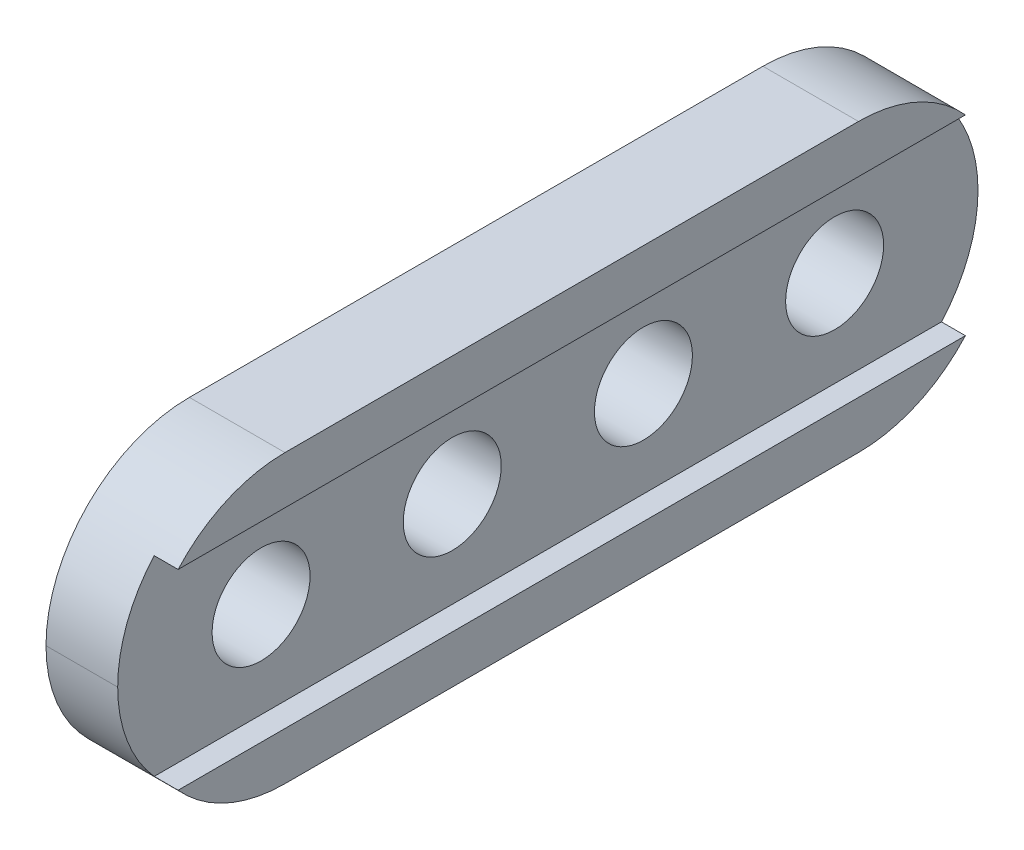
ISO-10303-21;
HEADER;
FILE_DESCRIPTION(('STEP AP214'),'2;1');
FILE_NAME('part.step','',(''),(''),'','','');
FILE_SCHEMA(('AUTOMOTIVE_DESIGN { 1 0 10303 214 1 1 1 1 }'));
ENDSEC;
DATA;
#1=APPLICATION_CONTEXT('core data for automotive mechanical design processes');
#2=APPLICATION_PROTOCOL_DEFINITION('international standard','automotive_design',2000,#1);
#3=PRODUCT_CONTEXT('',#1,'mechanical');
#4=PRODUCT('Part','Part','',(#3));
#5=PRODUCT_RELATED_PRODUCT_CATEGORY('part','',(#4));
#6=PRODUCT_DEFINITION_FORMATION('','',#4);
#7=PRODUCT_DEFINITION_CONTEXT('part definition',#1,'design');
#8=PRODUCT_DEFINITION('design','',#6,#7);
#9=PRODUCT_DEFINITION_SHAPE('','',#8);
#10=(LENGTH_UNIT() NAMED_UNIT(*) SI_UNIT(.MILLI.,.METRE.));
#11=(NAMED_UNIT(*) PLANE_ANGLE_UNIT() SI_UNIT($,.RADIAN.));
#12=(NAMED_UNIT(*) SI_UNIT($,.STERADIAN.) SOLID_ANGLE_UNIT());
#13=UNCERTAINTY_MEASURE_WITH_UNIT(LENGTH_MEASURE(1.E-05),#10,'distance_accuracy_value','');
#14=(GEOMETRIC_REPRESENTATION_CONTEXT(3) GLOBAL_UNCERTAINTY_ASSIGNED_CONTEXT((#13)) GLOBAL_UNIT_ASSIGNED_CONTEXT((#10,
#11,#12)) REPRESENTATION_CONTEXT('',''));
#15=CARTESIAN_POINT('',(0.,0.,0.));
#16=DIRECTION('',(0.,0.,1.));
#17=DIRECTION('',(1.,0.,0.));
#18=AXIS2_PLACEMENT_3D('',#15,#16,#17);
#19=CARTESIAN_POINT('',(0.,0.,-36.));
#20=DIRECTION('',(-1.,0.,0.));
#21=DIRECTION('',(0.,-1.,0.));
#22=AXIS2_PLACEMENT_3D('',#19,#20,#21);
#23=PLANE('',#22);
#24=CARTESIAN_POINT('',(0.,6.,-14.));
#25=DIRECTION('',(1.,0.,0.));
#26=DIRECTION('',(0.,-1.,0.));
#27=AXIS2_PLACEMENT_3D('',#24,#25,#26);
#28=CIRCLE('',#27,2.05);
#29=CARTESIAN_POINT('',(0.,3.95,-14.));
#30=VERTEX_POINT('',#29);
#31=EDGE_CURVE('E189',#30,#30,#28,.T.);
#32=ORIENTED_EDGE('',*,*,#31,.T.);
#33=EDGE_LOOP('',(#32));
#34=FACE_BOUND('',#33,.T.);
#35=CARTESIAN_POINT('',(0.,6.,-6.));
#36=DIRECTION('',(1.,0.,0.));
#37=DIRECTION('',(0.,-1.,0.));
#38=AXIS2_PLACEMENT_3D('',#35,#36,#37);
#39=CIRCLE('',#38,2.05);
#40=CARTESIAN_POINT('',(0.,3.95,-6.));
#41=VERTEX_POINT('',#40);
#42=EDGE_CURVE('E179',#41,#41,#39,.T.);
#43=ORIENTED_EDGE('',*,*,#42,.T.);
#44=EDGE_LOOP('',(#43));
#45=FACE_BOUND('',#44,.T.);
#46=CARTESIAN_POINT('',(0.,6.,-22.));
#47=DIRECTION('',(-1.,0.,0.));
#48=DIRECTION('',(0.,-1.,0.));
#49=AXIS2_PLACEMENT_3D('',#46,#47,#48);
#50=CIRCLE('',#49,2.05);
#51=CARTESIAN_POINT('',(0.,3.95,-22.));
#52=VERTEX_POINT('',#51);
#53=EDGE_CURVE('E176',#52,#52,#50,.T.);
#54=ORIENTED_EDGE('',*,*,#53,.F.);
#55=EDGE_LOOP('',(#54));
#56=FACE_BOUND('',#55,.T.);
#57=CARTESIAN_POINT('',(0.,6.,-30.));
#58=DIRECTION('',(-1.,0.,0.));
#59=DIRECTION('',(0.,-1.,0.));
#60=AXIS2_PLACEMENT_3D('',#57,#58,#59);
#61=CIRCLE('',#60,2.05);
#62=CARTESIAN_POINT('',(0.,3.95,-30.));
#63=VERTEX_POINT('',#62);
#64=EDGE_CURVE('E173',#63,#63,#61,.T.);
#65=ORIENTED_EDGE('',*,*,#64,.F.);
#66=EDGE_LOOP('',(#65));
#67=FACE_BOUND('',#66,.T.);
#68=CARTESIAN_POINT('',(0.,6.,-6.));
#69=DIRECTION('',(-1.,0.,0.));
#70=DIRECTION('',(0.,-1.,0.));
#71=AXIS2_PLACEMENT_3D('',#68,#69,#70);
#72=CIRCLE('',#71,6.);
#73=CARTESIAN_POINT('',(0.,0.,-6.));
#74=VERTEX_POINT('',#73);
#75=CARTESIAN_POINT('',(0.,6.,0.));
#76=VERTEX_POINT('',#75);
#77=EDGE_CURVE('E114',#74,#76,#72,.T.);
#78=ORIENTED_EDGE('',*,*,#77,.T.);
#79=CARTESIAN_POINT('',(0.,6.,-6.));
#80=DIRECTION('',(-1.,0.,0.));
#81=DIRECTION('',(0.,-1.,0.));
#82=AXIS2_PLACEMENT_3D('',#79,#80,#81);
#83=CIRCLE('',#82,6.);
#84=CARTESIAN_POINT('',(0.,12.,-6.));
#85=VERTEX_POINT('',#84);
#86=EDGE_CURVE('E118',#76,#85,#83,.T.);
#87=ORIENTED_EDGE('',*,*,#86,.T.);
#88=DIRECTION('',(0.,0.,1.));
#89=VECTOR('',#88,1.);
#90=CARTESIAN_POINT('',(0.,12.,-36.));
#91=LINE('',#90,#89);
#92=CARTESIAN_POINT('',(0.,12.,-30.));
#93=VERTEX_POINT('',#92);
#94=EDGE_CURVE('E194',#93,#85,#91,.T.);
#95=ORIENTED_EDGE('',*,*,#94,.F.);
#96=CARTESIAN_POINT('',(0.,6.,-30.));
#97=DIRECTION('',(-1.,0.,0.));
#98=DIRECTION('',(0.,-1.,0.));
#99=AXIS2_PLACEMENT_3D('',#96,#97,#98);
#100=CIRCLE('',#99,6.);
#101=CARTESIAN_POINT('',(0.,6.,-36.));
#102=VERTEX_POINT('',#101);
#103=EDGE_CURVE('E196',#93,#102,#100,.T.);
#104=ORIENTED_EDGE('',*,*,#103,.T.);
#105=CARTESIAN_POINT('',(0.,6.,-30.));
#106=DIRECTION('',(-1.,0.,0.));
#107=DIRECTION('',(0.,-1.,0.));
#108=AXIS2_PLACEMENT_3D('',#105,#106,#107);
#109=CIRCLE('',#108,6.);
#110=CARTESIAN_POINT('',(0.,0.,-30.));
#111=VERTEX_POINT('',#110);
#112=EDGE_CURVE('E124',#102,#111,#109,.T.);
#113=ORIENTED_EDGE('',*,*,#112,.T.);
#114=DIRECTION('',(0.,0.,1.));
#115=VECTOR('',#114,1.);
#116=CARTESIAN_POINT('',(0.,0.,-36.));
#117=LINE('',#116,#115);
#118=EDGE_CURVE('E121',#111,#74,#117,.T.);
#119=ORIENTED_EDGE('',*,*,#118,.T.);
#120=EDGE_LOOP('',(#78,#87,#95,#104,#113,#119));
#121=FACE_BOUND('',#120,.T.);
#122=ADVANCED_FACE('F33',(#34,#45,#56,#67,#121),#23,.T.);
#123=CARTESIAN_POINT('',(0.,12.,-36.));
#124=DIRECTION('',(0.,1.,0.));
#125=DIRECTION('',(0.,0.,1.));
#126=AXIS2_PLACEMENT_3D('',#123,#124,#125);
#127=PLANE('',#126);
#128=ORIENTED_EDGE('',*,*,#94,.T.);
#129=DIRECTION('',(-1.,0.,0.));
#130=VECTOR('',#129,1.);
#131=CARTESIAN_POINT('',(4.,12.,-6.));
#132=LINE('',#131,#130);
#133=CARTESIAN_POINT('',(4.,12.,-6.));
#134=VERTEX_POINT('',#133);
#135=EDGE_CURVE('E139',#85,#134,#132,.F.);
#136=ORIENTED_EDGE('',*,*,#135,.T.);
#137=DIRECTION('',(0.,0.,1.));
#138=VECTOR('',#137,1.);
#139=CARTESIAN_POINT('',(4.,12.,-36.));
#140=LINE('',#139,#138);
#141=CARTESIAN_POINT('',(4.,12.,-30.));
#142=VERTEX_POINT('',#141);
#143=EDGE_CURVE('E197',#142,#134,#140,.T.);
#144=ORIENTED_EDGE('',*,*,#143,.F.);
#145=DIRECTION('',(-1.,0.,0.));
#146=VECTOR('',#145,1.);
#147=CARTESIAN_POINT('',(0.,12.,-30.));
#148=LINE('',#147,#146);
#149=EDGE_CURVE('E140',#142,#93,#148,.T.);
#150=ORIENTED_EDGE('',*,*,#149,.T.);
#151=EDGE_LOOP('',(#128,#136,#144,#150));
#152=FACE_BOUND('',#151,.T.);
#153=ADVANCED_FACE('F232',(#152),#127,.T.);
#154=CARTESIAN_POINT('',(4.,10.,-36.));
#155=DIRECTION('',(1.,0.,0.));
#156=DIRECTION('',(0.,1.,0.));
#157=AXIS2_PLACEMENT_3D('',#154,#155,#156);
#158=PLANE('',#157);
#159=ORIENTED_EDGE('',*,*,#143,.T.);
#160=CARTESIAN_POINT('',(4.,6.,-6.));
#161=DIRECTION('',(1.,0.,0.));
#162=DIRECTION('',(0.,1.,0.));
#163=AXIS2_PLACEMENT_3D('',#160,#161,#162);
#164=CIRCLE('',#163,6.);
#165=CARTESIAN_POINT('',(4.,10.,-1.52786404500042));
#166=VERTEX_POINT('',#165);
#167=EDGE_CURVE('E148',#134,#166,#164,.T.);
#168=ORIENTED_EDGE('',*,*,#167,.T.);
#169=DIRECTION('',(0.,0.,1.));
#170=VECTOR('',#169,1.);
#171=CARTESIAN_POINT('',(4.,10.,-36.));
#172=LINE('',#171,#170);
#173=CARTESIAN_POINT('',(4.,10.,-34.4721359549996));
#174=VERTEX_POINT('',#173);
#175=EDGE_CURVE('E200',#174,#166,#172,.T.);
#176=ORIENTED_EDGE('',*,*,#175,.F.);
#177=CARTESIAN_POINT('',(4.,6.,-30.));
#178=DIRECTION('',(1.,0.,0.));
#179=DIRECTION('',(0.,1.,0.));
#180=AXIS2_PLACEMENT_3D('',#177,#178,#179);
#181=CIRCLE('',#180,6.);
#182=EDGE_CURVE('E146',#174,#142,#181,.T.);
#183=ORIENTED_EDGE('',*,*,#182,.T.);
#184=EDGE_LOOP('',(#159,#168,#176,#183));
#185=FACE_BOUND('',#184,.T.);
#186=ADVANCED_FACE('F238',(#185),#158,.T.);
#187=CARTESIAN_POINT('',(4.,10.,-36.));
#188=DIRECTION('',(0.,-1.,0.));
#189=DIRECTION('',(1.,0.,0.));
#190=AXIS2_PLACEMENT_3D('',#187,#188,#189);
#191=PLANE('',#190);
#192=ORIENTED_EDGE('',*,*,#175,.T.);
#193=DIRECTION('',(1.,0.,0.));
#194=VECTOR('',#193,1.);
#195=CARTESIAN_POINT('',(4.,10.,-1.52786404500042));
#196=LINE('',#195,#194);
#197=CARTESIAN_POINT('',(3.,10.,-1.52786404500042));
#198=VERTEX_POINT('',#197);
#199=EDGE_CURVE('E152',#166,#198,#196,.F.);
#200=ORIENTED_EDGE('',*,*,#199,.T.);
#201=DIRECTION('',(0.,0.,1.));
#202=VECTOR('',#201,1.);
#203=CARTESIAN_POINT('',(3.,10.,-36.));
#204=LINE('',#203,#202);
#205=CARTESIAN_POINT('',(3.,10.,-34.4721359549996));
#206=VERTEX_POINT('',#205);
#207=EDGE_CURVE('E203',#206,#198,#204,.T.);
#208=ORIENTED_EDGE('',*,*,#207,.F.);
#209=DIRECTION('',(-1.,0.,0.));
#210=VECTOR('',#209,1.);
#211=CARTESIAN_POINT('',(3.,10.,-34.4721359549996));
#212=LINE('',#211,#210);
#213=EDGE_CURVE('E150',#206,#174,#212,.F.);
#214=ORIENTED_EDGE('',*,*,#213,.T.);
#215=EDGE_LOOP('',(#192,#200,#208,#214));
#216=FACE_BOUND('',#215,.T.);
#217=ADVANCED_FACE('F264',(#216),#191,.T.);
#218=CARTESIAN_POINT('',(3.,10.,-36.));
#219=DIRECTION('',(1.,0.,0.));
#220=DIRECTION('',(0.,1.,0.));
#221=AXIS2_PLACEMENT_3D('',#218,#219,#220);
#222=PLANE('',#221);
#223=CARTESIAN_POINT('',(3.,6.,-14.));
#224=DIRECTION('',(1.,0.,0.));
#225=DIRECTION('',(0.,1.,0.));
#226=AXIS2_PLACEMENT_3D('',#223,#224,#225);
#227=CIRCLE('',#226,2.05);
#228=CARTESIAN_POINT('',(3.,8.05,-14.));
#229=VERTEX_POINT('',#228);
#230=EDGE_CURVE('E37',#229,#229,#227,.F.);
#231=ORIENTED_EDGE('',*,*,#230,.T.);
#232=EDGE_LOOP('',(#231));
#233=FACE_BOUND('',#232,.T.);
#234=CARTESIAN_POINT('',(3.,6.,-6.));
#235=DIRECTION('',(1.,0.,0.));
#236=DIRECTION('',(0.,1.,0.));
#237=AXIS2_PLACEMENT_3D('',#234,#235,#236);
#238=CIRCLE('',#237,2.05);
#239=CARTESIAN_POINT('',(3.,8.05,-6.));
#240=VERTEX_POINT('',#239);
#241=EDGE_CURVE('E177',#240,#240,#238,.F.);
#242=ORIENTED_EDGE('',*,*,#241,.T.);
#243=EDGE_LOOP('',(#242));
#244=FACE_BOUND('',#243,.T.);
#245=CARTESIAN_POINT('',(3.,6.,-22.));
#246=DIRECTION('',(1.,0.,0.));
#247=DIRECTION('',(0.,1.,0.));
#248=AXIS2_PLACEMENT_3D('',#245,#246,#247);
#249=CIRCLE('',#248,2.05);
#250=CARTESIAN_POINT('',(3.,8.05,-22.));
#251=VERTEX_POINT('',#250);
#252=EDGE_CURVE('E174',#251,#251,#249,.T.);
#253=ORIENTED_EDGE('',*,*,#252,.F.);
#254=EDGE_LOOP('',(#253));
#255=FACE_BOUND('',#254,.T.);
#256=CARTESIAN_POINT('',(3.,6.,-30.));
#257=DIRECTION('',(1.,0.,0.));
#258=DIRECTION('',(0.,1.,0.));
#259=AXIS2_PLACEMENT_3D('',#256,#257,#258);
#260=CIRCLE('',#259,2.05);
#261=CARTESIAN_POINT('',(3.,8.05,-30.));
#262=VERTEX_POINT('',#261);
#263=EDGE_CURVE('E170',#262,#262,#260,.T.);
#264=ORIENTED_EDGE('',*,*,#263,.F.);
#265=EDGE_LOOP('',(#264));
#266=FACE_BOUND('',#265,.T.);
#267=ORIENTED_EDGE('',*,*,#207,.T.);
#268=CARTESIAN_POINT('',(3.,6.,-6.));
#269=DIRECTION('',(1.,0.,0.));
#270=DIRECTION('',(0.,1.,0.));
#271=AXIS2_PLACEMENT_3D('',#268,#269,#270);
#272=CIRCLE('',#271,6.);
#273=CARTESIAN_POINT('',(3.,6.,0.));
#274=VERTEX_POINT('',#273);
#275=EDGE_CURVE('E159',#198,#274,#272,.T.);
#276=ORIENTED_EDGE('',*,*,#275,.T.);
#277=CARTESIAN_POINT('',(3.,6.,-6.));
#278=DIRECTION('',(1.,0.,0.));
#279=DIRECTION('',(0.,1.,0.));
#280=AXIS2_PLACEMENT_3D('',#277,#278,#279);
#281=CIRCLE('',#280,6.);
#282=CARTESIAN_POINT('',(3.,2.,-1.52786404500042));
#283=VERTEX_POINT('',#282);
#284=EDGE_CURVE('E131',#274,#283,#281,.T.);
#285=ORIENTED_EDGE('',*,*,#284,.T.);
#286=DIRECTION('',(0.,0.,1.));
#287=VECTOR('',#286,1.);
#288=CARTESIAN_POINT('',(3.,2.,-36.));
#289=LINE('',#288,#287);
#290=CARTESIAN_POINT('',(3.,2.,-34.4721359549996));
#291=VERTEX_POINT('',#290);
#292=EDGE_CURVE('E206',#291,#283,#289,.T.);
#293=ORIENTED_EDGE('',*,*,#292,.F.);
#294=CARTESIAN_POINT('',(3.,6.,-30.));
#295=DIRECTION('',(1.,0.,0.));
#296=DIRECTION('',(0.,1.,0.));
#297=AXIS2_PLACEMENT_3D('',#294,#295,#296);
#298=CIRCLE('',#297,6.);
#299=CARTESIAN_POINT('',(3.,6.,-36.));
#300=VERTEX_POINT('',#299);
#301=EDGE_CURVE('E156',#291,#300,#298,.T.);
#302=ORIENTED_EDGE('',*,*,#301,.T.);
#303=CARTESIAN_POINT('',(3.,6.,-30.));
#304=DIRECTION('',(1.,0.,0.));
#305=DIRECTION('',(0.,1.,0.));
#306=AXIS2_PLACEMENT_3D('',#303,#304,#305);
#307=CIRCLE('',#306,6.);
#308=EDGE_CURVE('E154',#300,#206,#307,.T.);
#309=ORIENTED_EDGE('',*,*,#308,.T.);
#310=EDGE_LOOP('',(#267,#276,#285,#293,#302,#309));
#311=FACE_BOUND('',#310,.T.);
#312=ADVANCED_FACE('F258',(#233,#244,#255,#266,#311),#222,.T.);
#313=CARTESIAN_POINT('',(4.,2.,-36.));
#314=DIRECTION('',(0.,1.,0.));
#315=DIRECTION('',(-1.,0.,0.));
#316=AXIS2_PLACEMENT_3D('',#313,#314,#315);
#317=PLANE('',#316);
#318=ORIENTED_EDGE('',*,*,#292,.T.);
#319=DIRECTION('',(-1.,0.,0.));
#320=VECTOR('',#319,1.);
#321=CARTESIAN_POINT('',(3.,2.,-1.52786404500042));
#322=LINE('',#321,#320);
#323=CARTESIAN_POINT('',(4.,2.,-1.52786404500042));
#324=VERTEX_POINT('',#323);
#325=EDGE_CURVE('E163',#283,#324,#322,.F.);
#326=ORIENTED_EDGE('',*,*,#325,.T.);
#327=DIRECTION('',(0.,0.,1.));
#328=VECTOR('',#327,1.);
#329=CARTESIAN_POINT('',(4.,2.,-36.));
#330=LINE('',#329,#328);
#331=CARTESIAN_POINT('',(4.,2.,-34.4721359549996));
#332=VERTEX_POINT('',#331);
#333=EDGE_CURVE('E209',#332,#324,#330,.T.);
#334=ORIENTED_EDGE('',*,*,#333,.F.);
#335=DIRECTION('',(1.,0.,0.));
#336=VECTOR('',#335,1.);
#337=CARTESIAN_POINT('',(4.,2.,-34.4721359549996));
#338=LINE('',#337,#336);
#339=EDGE_CURVE('E161',#332,#291,#338,.F.);
#340=ORIENTED_EDGE('',*,*,#339,.T.);
#341=EDGE_LOOP('',(#318,#326,#334,#340));
#342=FACE_BOUND('',#341,.T.);
#343=ADVANCED_FACE('F254',(#342),#317,.T.);
#344=CARTESIAN_POINT('',(4.,0.,-36.));
#345=DIRECTION('',(1.,0.,0.));
#346=DIRECTION('',(0.,1.,0.));
#347=AXIS2_PLACEMENT_3D('',#344,#345,#346);
#348=PLANE('',#347);
#349=ORIENTED_EDGE('',*,*,#333,.T.);
#350=CARTESIAN_POINT('',(4.,6.,-6.));
#351=DIRECTION('',(1.,0.,0.));
#352=DIRECTION('',(0.,1.,0.));
#353=AXIS2_PLACEMENT_3D('',#350,#351,#352);
#354=CIRCLE('',#353,6.);
#355=CARTESIAN_POINT('',(4.,0.,-6.));
#356=VERTEX_POINT('',#355);
#357=EDGE_CURVE('E50',#324,#356,#354,.T.);
#358=ORIENTED_EDGE('',*,*,#357,.T.);
#359=DIRECTION('',(0.,0.,1.));
#360=VECTOR('',#359,1.);
#361=CARTESIAN_POINT('',(4.,0.,-36.));
#362=LINE('',#361,#360);
#363=CARTESIAN_POINT('',(4.,0.,-30.));
#364=VERTEX_POINT('',#363);
#365=EDGE_CURVE('E211',#364,#356,#362,.T.);
#366=ORIENTED_EDGE('',*,*,#365,.F.);
#367=CARTESIAN_POINT('',(4.,6.,-30.));
#368=DIRECTION('',(1.,0.,0.));
#369=DIRECTION('',(0.,1.,0.));
#370=AXIS2_PLACEMENT_3D('',#367,#368,#369);
#371=CIRCLE('',#370,6.);
#372=EDGE_CURVE('E58',#364,#332,#371,.T.);
#373=ORIENTED_EDGE('',*,*,#372,.T.);
#374=EDGE_LOOP('',(#349,#358,#366,#373));
#375=FACE_BOUND('',#374,.T.);
#376=ADVANCED_FACE('F250',(#375),#348,.T.);
#377=CARTESIAN_POINT('',(0.,0.,-36.));
#378=DIRECTION('',(0.,-1.,0.));
#379=DIRECTION('',(0.,0.,-1.));
#380=AXIS2_PLACEMENT_3D('',#377,#378,#379);
#381=PLANE('',#380);
#382=ORIENTED_EDGE('',*,*,#365,.T.);
#383=DIRECTION('',(1.,0.,0.));
#384=VECTOR('',#383,1.);
#385=CARTESIAN_POINT('',(0.,0.,-6.));
#386=LINE('',#385,#384);
#387=EDGE_CURVE('E11',#356,#74,#386,.F.);
#388=ORIENTED_EDGE('',*,*,#387,.T.);
#389=ORIENTED_EDGE('',*,*,#118,.F.);
#390=DIRECTION('',(1.,0.,0.));
#391=VECTOR('',#390,1.);
#392=CARTESIAN_POINT('',(0.,0.,-30.));
#393=LINE('',#392,#391);
#394=EDGE_CURVE('E42',#111,#364,#393,.T.);
#395=ORIENTED_EDGE('',*,*,#394,.T.);
#396=EDGE_LOOP('',(#382,#388,#389,#395));
#397=FACE_BOUND('',#396,.T.);
#398=ADVANCED_FACE('F218',(#397),#381,.T.);
#399=CARTESIAN_POINT('',(0.,6.,-6.));
#400=DIRECTION('',(-1.,0.,0.));
#401=DIRECTION('',(0.,0.,1.));
#402=AXIS2_PLACEMENT_3D('',#399,#400,#401);
#403=CYLINDRICAL_SURFACE('',#402,6.);
#404=ORIENTED_EDGE('',*,*,#325,.F.);
#405=ORIENTED_EDGE('',*,*,#284,.F.);
#406=DIRECTION('',(1.,0.,0.));
#407=VECTOR('',#406,1.);
#408=CARTESIAN_POINT('',(4.,6.,0.));
#409=LINE('',#408,#407);
#410=EDGE_CURVE('E128',#76,#274,#409,.T.);
#411=ORIENTED_EDGE('',*,*,#410,.F.);
#412=ORIENTED_EDGE('',*,*,#77,.F.);
#413=ORIENTED_EDGE('',*,*,#387,.F.);
#414=ORIENTED_EDGE('',*,*,#357,.F.);
#415=EDGE_LOOP('',(#404,#405,#411,#412,#413,#414));
#416=FACE_BOUND('',#415,.T.);
#417=ADVANCED_FACE('F130',(#416),#403,.T.);
#418=CARTESIAN_POINT('',(0.,6.,-6.));
#419=DIRECTION('',(1.,0.,0.));
#420=DIRECTION('',(0.,0.,-1.));
#421=AXIS2_PLACEMENT_3D('',#418,#419,#420);
#422=CYLINDRICAL_SURFACE('',#421,6.);
#423=ORIENTED_EDGE('',*,*,#167,.F.);
#424=ORIENTED_EDGE('',*,*,#135,.F.);
#425=ORIENTED_EDGE('',*,*,#86,.F.);
#426=ORIENTED_EDGE('',*,*,#410,.T.);
#427=ORIENTED_EDGE('',*,*,#275,.F.);
#428=ORIENTED_EDGE('',*,*,#199,.F.);
#429=EDGE_LOOP('',(#423,#424,#425,#426,#427,#428));
#430=FACE_BOUND('',#429,.T.);
#431=ADVANCED_FACE('F137',(#430),#422,.T.);
#432=CARTESIAN_POINT('',(0.,6.,-30.));
#433=DIRECTION('',(-1.,0.,0.));
#434=DIRECTION('',(0.,0.,1.));
#435=AXIS2_PLACEMENT_3D('',#432,#433,#434);
#436=CYLINDRICAL_SURFACE('',#435,6.);
#437=DIRECTION('',(-1.,0.,0.));
#438=VECTOR('',#437,1.);
#439=CARTESIAN_POINT('',(0.,6.,-36.));
#440=LINE('',#439,#438);
#441=EDGE_CURVE('E134',#102,#300,#440,.F.);
#442=ORIENTED_EDGE('',*,*,#441,.F.);
#443=ORIENTED_EDGE('',*,*,#103,.F.);
#444=ORIENTED_EDGE('',*,*,#149,.F.);
#445=ORIENTED_EDGE('',*,*,#182,.F.);
#446=ORIENTED_EDGE('',*,*,#213,.F.);
#447=ORIENTED_EDGE('',*,*,#308,.F.);
#448=EDGE_LOOP('',(#442,#443,#444,#445,#446,#447));
#449=FACE_BOUND('',#448,.T.);
#450=ADVANCED_FACE('F35',(#449),#436,.T.);
#451=CARTESIAN_POINT('',(0.,6.,-30.));
#452=DIRECTION('',(1.,0.,0.));
#453=DIRECTION('',(0.,0.,-1.));
#454=AXIS2_PLACEMENT_3D('',#451,#452,#453);
#455=CYLINDRICAL_SURFACE('',#454,6.);
#456=ORIENTED_EDGE('',*,*,#112,.F.);
#457=ORIENTED_EDGE('',*,*,#441,.T.);
#458=ORIENTED_EDGE('',*,*,#301,.F.);
#459=ORIENTED_EDGE('',*,*,#339,.F.);
#460=ORIENTED_EDGE('',*,*,#372,.F.);
#461=ORIENTED_EDGE('',*,*,#394,.F.);
#462=EDGE_LOOP('',(#456,#457,#458,#459,#460,#461));
#463=FACE_BOUND('',#462,.T.);
#464=ADVANCED_FACE('F219',(#463),#455,.T.);
#465=CARTESIAN_POINT('',(4.,6.,-30.));
#466=DIRECTION('',(-1.,0.,0.));
#467=DIRECTION('',(0.,-1.,0.));
#468=AXIS2_PLACEMENT_3D('',#465,#466,#467);
#469=CYLINDRICAL_SURFACE('',#468,2.05);
#470=ORIENTED_EDGE('',*,*,#263,.T.);
#471=EDGE_LOOP('',(#470));
#472=FACE_BOUND('',#471,.T.);
#473=ORIENTED_EDGE('',*,*,#64,.T.);
#474=EDGE_LOOP('',(#473));
#475=FACE_BOUND('',#474,.T.);
#476=ADVANCED_FACE('F221',(#472,#475),#469,.F.);
#477=CARTESIAN_POINT('',(4.,6.,-22.));
#478=DIRECTION('',(-1.,0.,0.));
#479=DIRECTION('',(0.,-1.,0.));
#480=AXIS2_PLACEMENT_3D('',#477,#478,#479);
#481=CYLINDRICAL_SURFACE('',#480,2.05);
#482=ORIENTED_EDGE('',*,*,#252,.T.);
#483=EDGE_LOOP('',(#482));
#484=FACE_BOUND('',#483,.T.);
#485=ORIENTED_EDGE('',*,*,#53,.T.);
#486=EDGE_LOOP('',(#485));
#487=FACE_BOUND('',#486,.T.);
#488=ADVANCED_FACE('F226',(#484,#487),#481,.F.);
#489=CARTESIAN_POINT('',(4.,6.,-6.));
#490=DIRECTION('',(-1.,0.,0.));
#491=DIRECTION('',(0.,-1.,0.));
#492=AXIS2_PLACEMENT_3D('',#489,#490,#491);
#493=CYLINDRICAL_SURFACE('',#492,2.05);
#494=ORIENTED_EDGE('',*,*,#241,.F.);
#495=EDGE_LOOP('',(#494));
#496=FACE_BOUND('',#495,.T.);
#497=ORIENTED_EDGE('',*,*,#42,.F.);
#498=EDGE_LOOP('',(#497));
#499=FACE_BOUND('',#498,.T.);
#500=ADVANCED_FACE('F274',(#496,#499),#493,.F.);
#501=CARTESIAN_POINT('',(4.,6.,-14.));
#502=DIRECTION('',(-1.,0.,0.));
#503=DIRECTION('',(0.,-1.,0.));
#504=AXIS2_PLACEMENT_3D('',#501,#502,#503);
#505=CYLINDRICAL_SURFACE('',#504,2.05);
#506=ORIENTED_EDGE('',*,*,#230,.F.);
#507=EDGE_LOOP('',(#506));
#508=FACE_BOUND('',#507,.T.);
#509=ORIENTED_EDGE('',*,*,#31,.F.);
#510=EDGE_LOOP('',(#509));
#511=FACE_BOUND('',#510,.T.);
#512=ADVANCED_FACE('F278',(#508,#511),#505,.F.);
#513=CLOSED_SHELL('',(#122,#153,#186,#217,#312,#343,#376,#398,#417,#431,#450,#464,#476,#488,
#500,#512));
#514=MANIFOLD_SOLID_BREP('B2',#513);
#515=ADVANCED_BREP_SHAPE_REPRESENTATION('',(#18,#514),#14);
#516=SHAPE_DEFINITION_REPRESENTATION(#9,#515);
ENDSEC;
END-ISO-10303-21;
